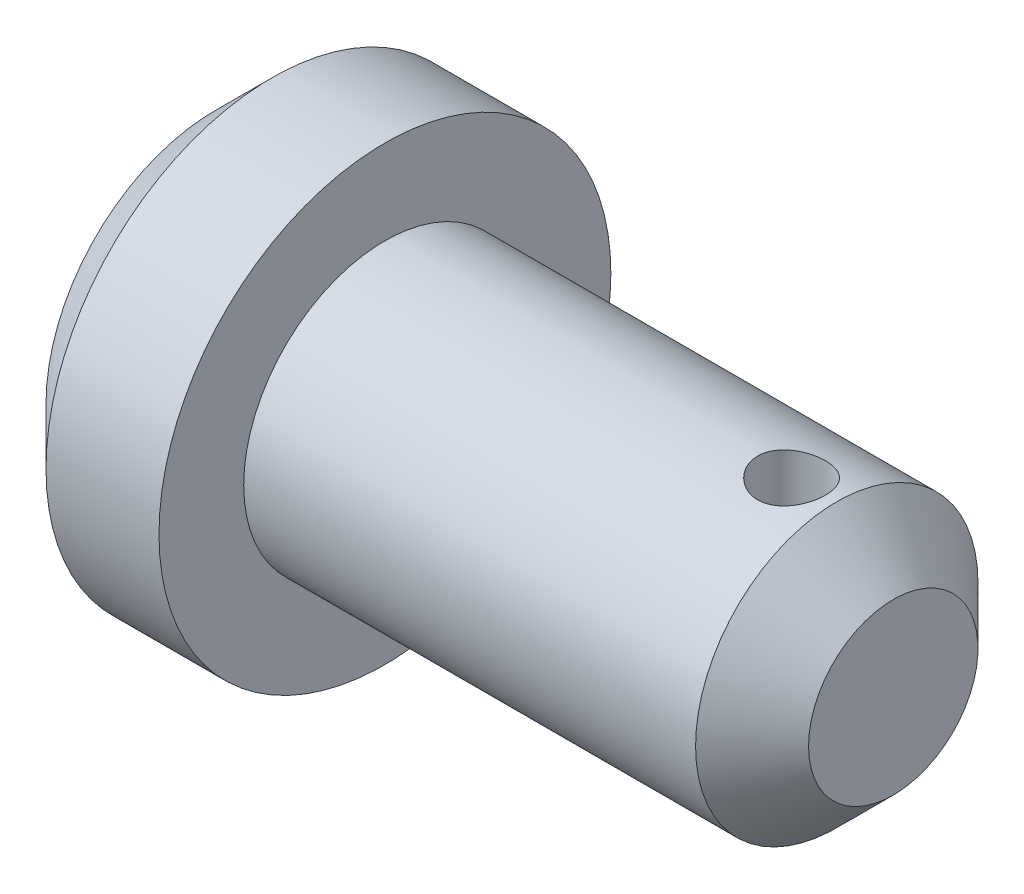
ISO-10303-21;
HEADER;
FILE_DESCRIPTION(('STEP AP214'),'2;1');
FILE_NAME('part.step','',(''),(''),'','','');
FILE_SCHEMA(('AUTOMOTIVE_DESIGN { 1 0 10303 214 1 1 1 1 }'));
ENDSEC;
DATA;
#1=APPLICATION_CONTEXT('core data for automotive mechanical design processes');
#2=APPLICATION_PROTOCOL_DEFINITION('international standard','automotive_design',2000,#1);
#3=PRODUCT_CONTEXT('',#1,'mechanical');
#4=PRODUCT('Part','Part','',(#3));
#5=PRODUCT_RELATED_PRODUCT_CATEGORY('part','',(#4));
#6=PRODUCT_DEFINITION_FORMATION('','',#4);
#7=PRODUCT_DEFINITION_CONTEXT('part definition',#1,'design');
#8=PRODUCT_DEFINITION('design','',#6,#7);
#9=PRODUCT_DEFINITION_SHAPE('','',#8);
#10=(LENGTH_UNIT() NAMED_UNIT(*) SI_UNIT(.MILLI.,.METRE.));
#11=(NAMED_UNIT(*) PLANE_ANGLE_UNIT() SI_UNIT($,.RADIAN.));
#12=(NAMED_UNIT(*) SI_UNIT($,.STERADIAN.) SOLID_ANGLE_UNIT());
#13=UNCERTAINTY_MEASURE_WITH_UNIT(LENGTH_MEASURE(1.E-05),#10,'distance_accuracy_value','');
#14=(GEOMETRIC_REPRESENTATION_CONTEXT(3) GLOBAL_UNCERTAINTY_ASSIGNED_CONTEXT((#13)) GLOBAL_UNIT_ASSIGNED_CONTEXT((#10,
#11,#12)) REPRESENTATION_CONTEXT('',''));
#15=CARTESIAN_POINT('',(0.,0.,0.));
#16=DIRECTION('',(0.,0.,1.));
#17=DIRECTION('',(1.,0.,0.));
#18=AXIS2_PLACEMENT_3D('',#15,#16,#17);
#19=CARTESIAN_POINT('',(0.,0.,0.));
#20=DIRECTION('',(-1.,0.,0.));
#21=DIRECTION('',(0.,0.,1.));
#22=AXIS2_PLACEMENT_3D('',#19,#20,#21);
#23=CYLINDRICAL_SURFACE('',#22,25.);
#24=CARTESIAN_POINT('',(102.,-24.2693221990232,-6.));
#25=CARTESIAN_POINT('',(101.834059732421,-24.2693192173439,-6.00000460058749));
#26=CARTESIAN_POINT('',(101.668170927862,-24.2710270328907,-5.99311472313627));
#27=CARTESIAN_POINT('',(101.337554797768,-24.2777997433195,-5.96562344868169));
#28=CARTESIAN_POINT('',(101.172827621959,-24.2828650632483,-5.94502031563237));
#29=CARTESIAN_POINT('',(100.845720994805,-24.2962060432289,-5.89025958920488));
#30=CARTESIAN_POINT('',(100.683342422632,-24.304482874777,-5.85609704951731));
#31=CARTESIAN_POINT('',(100.362077676706,-24.324002012079,-5.77448580831014));
#32=CARTESIAN_POINT('',(100.203192816905,-24.3352454135442,-5.72703219729494));
#33=CARTESIAN_POINT('',(99.8903344673029,-24.3603450339749,-5.61930954739399));
#34=CARTESIAN_POINT('',(99.7363534382128,-24.3741969907612,-5.55906139358703));
#35=CARTESIAN_POINT('',(99.4340110530831,-24.4041320001377,-5.42613868912028));
#36=CARTESIAN_POINT('',(99.2856517976633,-24.420215876438,-5.35345954837853));
#37=CARTESIAN_POINT('',(98.9956383615798,-24.4541500249133,-5.19624934621714));
#38=CARTESIAN_POINT('',(98.8539816961744,-24.471999634801,-5.11172272360157));
#39=CARTESIAN_POINT('',(98.5781694487184,-24.5089827826595,-4.93135257338601));
#40=CARTESIAN_POINT('',(98.4440167113146,-24.5281168015673,-4.83550479634857));
#41=CARTESIAN_POINT('',(98.1817872297769,-24.5674915774464,-4.63134479435269));
#42=CARTESIAN_POINT('',(98.0538624286457,-24.5877460219987,-4.52284000132129));
#43=CARTESIAN_POINT('',(97.8075154504067,-24.628482704143,-4.29548353417837));
#44=CARTESIAN_POINT('',(97.6890968171529,-24.6489650234755,-4.17662803548193));
#45=CARTESIAN_POINT('',(97.4626293146081,-24.6895792444555,-3.92942214664513));
#46=CARTESIAN_POINT('',(97.3545775870675,-24.7097112414296,-3.80107439098764));
#47=CARTESIAN_POINT('',(97.1495012350933,-24.749084932891,-3.53564701496837));
#48=CARTESIAN_POINT('',(97.0524806874831,-24.7683262966769,-3.39856419538247));
#49=CARTESIAN_POINT('',(96.86905555161,-24.805612728147,-3.11485061597086));
#50=CARTESIAN_POINT('',(96.7827982775735,-24.8236399057151,-2.96812218206264));
#51=CARTESIAN_POINT('',(96.6229465907055,-24.8577272433076,-2.66763492888514));
#52=CARTESIAN_POINT('',(96.5493569572847,-24.8737866602544,-2.51387348368351));
#53=CARTESIAN_POINT('',(96.4154867338232,-24.9034639147108,-2.20050084057474));
#54=CARTESIAN_POINT('',(96.3551998030764,-24.917082914856,-2.04089247207775));
#55=CARTESIAN_POINT('',(96.2483649391805,-24.9415044760467,-1.71693448898555));
#56=CARTESIAN_POINT('',(96.2018219511619,-24.9523060231976,-1.55258319115472));
#57=CARTESIAN_POINT('',(96.0849911599461,-24.9796180760798,-1.0604267514532));
#58=CARTESIAN_POINT('',(96.0348243465292,-24.9916494382249,-0.727223064781638));
#59=CARTESIAN_POINT('',(96.0018598223319,-24.9995546719704,-0.225051972672738));
#60=CARTESIAN_POINT('',(95.9979260461296,-25.0004978214515,-0.0572008556931647));
#61=CARTESIAN_POINT('',(96.0041100366233,-24.9990135577545,0.278247999700321));
#62=CARTESIAN_POINT('',(96.014227977215,-24.9965861028638,0.445845734952837));
#63=CARTESIAN_POINT('',(96.0649257254733,-24.9844710986104,0.939451198306504));
#64=CARTESIAN_POINT('',(96.1253937190891,-24.9700581884779,1.26352376365918));
#65=CARTESIAN_POINT('',(96.2981839251966,-24.9299774285752,1.89661000878181));
#66=CARTESIAN_POINT('',(96.4105087710679,-24.9043090072343,2.20562292291579));
#67=CARTESIAN_POINT('',(96.6847735436076,-24.8441871252282,2.80308340285013));
#68=CARTESIAN_POINT('',(96.8471264788453,-24.8096609520016,3.09133416391588));
#69=CARTESIAN_POINT('',(97.2165269000294,-24.7355808399422,3.63689114777195));
#70=CARTESIAN_POINT('',(97.423581610417,-24.6960260888452,3.89419235819688));
#71=CARTESIAN_POINT('',(97.8826307930772,-24.6150468786432,4.37733250714646));
#72=CARTESIAN_POINT('',(98.1356187298665,-24.5736003966327,4.60222487048295));
#73=CARTESIAN_POINT('',(98.6761512747884,-24.4944202534268,5.00659136952867));
#74=CARTESIAN_POINT('',(98.9636972486,-24.4566867390692,5.18606370943939));
#75=CARTESIAN_POINT('',(99.5669305117367,-24.3891322466935,5.4950396533725));
#76=CARTESIAN_POINT('',(99.8827301014658,-24.3593449045093,5.62433186444417));
#77=CARTESIAN_POINT('',(100.532466247427,-24.3114966451333,5.82770650444349));
#78=CARTESIAN_POINT('',(100.866399250898,-24.2934334398264,5.90179970658058));
#79=CARTESIAN_POINT('',(101.534186758633,-24.2715545321338,5.99113700492853));
#80=CARTESIAN_POINT('',(101.867844139552,-24.2674017566251,6.00777368474904));
#81=CARTESIAN_POINT('',(102.533166393619,-24.2728991225919,5.98552405004056));
#82=CARTESIAN_POINT('',(102.86483143198,-24.2825481032417,5.9466424049974));
#83=CARTESIAN_POINT('',(103.511691814451,-24.3142403018894,5.81567711192227));
#84=CARTESIAN_POINT('',(103.827058277452,-24.3360979424442,5.72438949541309));
#85=CARTESIAN_POINT('',(104.438015715724,-24.3895714349639,5.49207803402932));
#86=CARTESIAN_POINT('',(104.733604488375,-24.421188371618,5.35104866039818));
#87=CARTESIAN_POINT('',(105.302557221846,-24.491337816706,5.0202958832683));
#88=CARTESIAN_POINT('',(105.575417684589,-24.529985907154,4.82973151657672));
#89=CARTESIAN_POINT('',(106.085802531372,-24.609553113729,4.40637723136316));
#90=CARTESIAN_POINT('',(106.32332157398,-24.6504725718652,4.17358094176829));
#91=CARTESIAN_POINT('',(106.761825956424,-24.7311017019711,3.66607172916322));
#92=CARTESIAN_POINT('',(106.961852187838,-24.770762345906,3.3905223617437));
#93=CARTESIAN_POINT('',(107.312832249533,-24.8434406642277,2.80874047615626));
#94=CARTESIAN_POINT('',(107.4637885744,-24.8764586762761,2.50250951879602));
#95=CARTESIAN_POINT('',(107.649364452397,-24.9181020803638,2.02815096730082));
#96=CARTESIAN_POINT('',(107.704308244051,-24.9306431435962,1.86803584664664));
#97=CARTESIAN_POINT('',(107.800515366414,-24.9528307363167,1.54356696295539));
#98=CARTESIAN_POINT('',(107.841783825984,-24.9624783508485,1.3792148139756));
#99=CARTESIAN_POINT('',(107.910290311299,-24.9785993962541,1.04746058126015));
#100=CARTESIAN_POINT('',(107.937527628012,-24.9850726667188,0.88005834383764));
#101=CARTESIAN_POINT('',(107.977740185572,-24.994659296045,0.543455945222832));
#102=CARTESIAN_POINT('',(107.99071603876,-24.997772799164,0.374255861539254));
#103=CARTESIAN_POINT('',(108.002147010849,-25.0005148115007,0.039572166263602));
#104=CARTESIAN_POINT('',(108.000956570223,-25.0002283873103,-0.125898766906477));
#105=CARTESIAN_POINT('',(107.984919900709,-24.9963838456846,-0.456136647513656));
#106=CARTESIAN_POINT('',(107.970073968145,-24.9928257992435,-0.620903610148953));
#107=CARTESIAN_POINT('',(107.926847259929,-24.9825354772041,-0.948575696498029));
#108=CARTESIAN_POINT('',(107.898464447974,-24.9758027240481,-1.11148053632313));
#109=CARTESIAN_POINT('',(107.828408810135,-24.9593507893913,-1.434191004048));
#110=CARTESIAN_POINT('',(107.786740696019,-24.9496326667265,-1.59399770944887));
#111=CARTESIAN_POINT('',(107.690650753289,-24.9275215666658,-1.90878490028135));
#112=CARTESIAN_POINT('',(107.636284317004,-24.9151402247435,-2.06378312590839));
#113=CARTESIAN_POINT('',(107.515138852887,-24.8880146824749,-2.36857079597771));
#114=CARTESIAN_POINT('',(107.448364162904,-24.8732713081285,-2.51836203909183));
#115=CARTESIAN_POINT('',(107.302847567221,-24.841802398867,-2.81187682420641));
#116=CARTESIAN_POINT('',(107.224100462436,-24.8250760035128,-2.95559769529925));
#117=CARTESIAN_POINT('',(107.055243309792,-24.7900921246488,-3.23593617076045));
#118=CARTESIAN_POINT('',(106.965137043432,-24.7718351513474,-3.37255611776949));
#119=CARTESIAN_POINT('',(106.771977422558,-24.7338351675459,-3.64090348698623));
#120=CARTESIAN_POINT('',(106.668676486658,-24.7140678232284,-3.77244930795077));
#121=CARTESIAN_POINT('',(106.451544769352,-24.6739715765701,-4.02636882328124));
#122=CARTESIAN_POINT('',(106.337717606122,-24.6536428688592,-4.14874564331391));
#123=CARTESIAN_POINT('',(106.100184609401,-24.6129603609016,-4.38365180469934));
#124=CARTESIAN_POINT('',(105.976472868406,-24.5926065529162,-4.49617517167719));
#125=CARTESIAN_POINT('',(105.720085361673,-24.5524543239015,-4.71050671781096));
#126=CARTESIAN_POINT('',(105.587412870277,-24.532655703704,-4.81231877656934));
#127=CARTESIAN_POINT('',(105.311562626492,-24.4938254842292,-5.00624248933444));
#128=CARTESIAN_POINT('',(105.168243136498,-24.474813007441,-5.09815651544129));
#129=CARTESIAN_POINT('',(104.874205691691,-24.4384897622653,-5.26952462166943));
#130=CARTESIAN_POINT('',(104.723490485579,-24.4211783687267,-5.34898328559685));
#131=CARTESIAN_POINT('',(104.415717284004,-24.3887740639133,-5.49484184745972));
#132=CARTESIAN_POINT('',(104.258662364921,-24.3736800927344,-5.56124798952492));
#133=CARTESIAN_POINT('',(103.939315517869,-24.3461620490209,-5.6805037284954));
#134=CARTESIAN_POINT('',(103.77702444086,-24.3337375451432,-5.7333555158345));
#135=CARTESIAN_POINT('',(103.350944402755,-24.3054947105591,-5.85223691155717));
#136=CARTESIAN_POINT('',(103.083926407974,-24.2920191452792,-5.90755575023753));
#137=CARTESIAN_POINT('',(102.544559192327,-24.2739356520306,-5.98143220718613));
#138=CARTESIAN_POINT('',(102.272210353942,-24.2693270902047,-5.99999245314254));
#139=CARTESIAN_POINT('',(102.,-24.2693221990232,-6.));
#140=B_SPLINE_CURVE_WITH_KNOTS('',3,(#24,#25,#26,#27,#28,#29,#30,#31,#32,#33,#34,#35,#36,#37,
#38,#39,#40,#41,#42,#43,#44,#45,#46,#47,#48,#49,#50,#51,#52,#53,#54,#55,#56,#57,#58,#59,#60,#61,
#62,#63,#64,#65,#66,#67,#68,#69,#70,#71,#72,#73,#74,#75,#76,#77,#78,#79,#80,#81,#82,#83,#84,#85,
#86,#87,#88,#89,#90,#91,#92,#93,#94,#95,#96,#97,#98,#99,#100,#101,#102,#103,#104,#105,#106,#107,
#108,#109,#110,#111,#112,#113,#114,#115,#116,#117,#118,#119,#120,#121,#122,#123,#124,#125,#126,
#127,#128,#129,#130,#131,#132,#133,#134,#135,#136,#137,#138,#139),.UNSPECIFIED.,.T.,.F.,(4,2,2,
2,2,2,2,2,2,2,2,2,2,2,2,2,2,2,2,2,2,2,2,2,2,2,2,2,2,2,2,2,2,2,2,2,2,2,2,2,2,2,2,2,2,2,2,2,2,2,2,
2,2,2,2,2,2,4),(0.,0.49758059138039,0.995224186553656,1.4930494832496,1.99105891120689,
2.48826158123244,2.98564823885731,3.48284904015122,3.98023706425766,4.48653742340698,
4.99302566076187,5.4993738510141,6.00590856964271,6.51875380835026,7.03179211782624,
7.54458535785561,8.05756287894231,9.06317072582739,9.56637068685641,10.0695768752428,
11.0544731736286,12.0394194922331,13.0327253814724,14.0261919233719,15.0444773123883,
16.0628029556731,17.0853730875996,18.1077435918426,19.1051538629732,20.10248024975,
21.0850439079104,22.0677168116698,23.0683069952269,24.0690482527067,25.0926627677996,
26.1162252368616,26.624940138715,27.1334640332021,27.6420136222755,28.150541375013,
28.6463730888496,29.1421940434048,29.6380896060201,30.1338094895388,30.6274060608767,
31.1208303973834,31.6144696213306,32.1079449431356,32.6126284711583,33.1171391648262,
33.6219536669565,34.1265846927702,34.6399206216221,35.1530671874621,35.6659676710412,
36.1787852157025,36.9950805869967,37.8113176033061),.UNSPECIFIED.);
#141=CARTESIAN_POINT('',(102.,-24.2693221990232,-6.));
#142=VERTEX_POINT('',#141);
#143=EDGE_CURVE('E53',#142,#142,#140,.T.);
#144=ORIENTED_EDGE('',*,*,#143,.T.);
#145=EDGE_LOOP('',(#144));
#146=FACE_BOUND('',#145,.T.);
#147=CARTESIAN_POINT('',(110.,0.,0.));
#148=DIRECTION('',(-1.,0.,0.));
#149=DIRECTION('',(0.,0.,1.));
#150=AXIS2_PLACEMENT_3D('',#147,#148,#149);
#151=CIRCLE('',#150,25.);
#152=CARTESIAN_POINT('',(110.,0.,25.));
#153=VERTEX_POINT('',#152);
#154=EDGE_CURVE('E45',#153,#153,#151,.T.);
#155=ORIENTED_EDGE('',*,*,#154,.T.);
#156=EDGE_LOOP('',(#155));
#157=FACE_BOUND('',#156,.T.);
#158=CARTESIAN_POINT('',(30.,0.,0.));
#159=DIRECTION('',(-1.,0.,0.));
#160=DIRECTION('',(0.,0.,1.));
#161=AXIS2_PLACEMENT_3D('',#158,#159,#160);
#162=CIRCLE('',#161,25.);
#163=CARTESIAN_POINT('',(30.,0.,25.));
#164=VERTEX_POINT('',#163);
#165=EDGE_CURVE('E94',#164,#164,#162,.T.);
#166=ORIENTED_EDGE('',*,*,#165,.F.);
#167=EDGE_LOOP('',(#166));
#168=FACE_BOUND('',#167,.T.);
#169=CARTESIAN_POINT('',(102.,24.2693221990232,-6.));
#170=CARTESIAN_POINT('',(102.165940267579,24.2693192173439,-6.00000460058749));
#171=CARTESIAN_POINT('',(102.331829072138,24.2710270328907,-5.99311472313627));
#172=CARTESIAN_POINT('',(102.662445202232,24.2777997433195,-5.96562344868169));
#173=CARTESIAN_POINT('',(102.827172378041,24.2828650632483,-5.94502031563237));
#174=CARTESIAN_POINT('',(103.154279005195,24.2962060432289,-5.89025958920488));
#175=CARTESIAN_POINT('',(103.316657577368,24.304482874777,-5.85609704951731));
#176=CARTESIAN_POINT('',(103.637922323294,24.324002012079,-5.77448580831014));
#177=CARTESIAN_POINT('',(103.796807183095,24.3352454135442,-5.72703219729494));
#178=CARTESIAN_POINT('',(104.109665532697,24.3603450339749,-5.61930954739399));
#179=CARTESIAN_POINT('',(104.263646561787,24.3741969907612,-5.55906139358703));
#180=CARTESIAN_POINT('',(104.565988946917,24.4041320001377,-5.42613868912028));
#181=CARTESIAN_POINT('',(104.714348202337,24.420215876438,-5.35345954837853));
#182=CARTESIAN_POINT('',(105.00436163842,24.4541500249133,-5.19624934621714));
#183=CARTESIAN_POINT('',(105.146018303826,24.471999634801,-5.11172272360157));
#184=CARTESIAN_POINT('',(105.421830551282,24.5089827826595,-4.93135257338601));
#185=CARTESIAN_POINT('',(105.555983288685,24.5281168015673,-4.83550479634857));
#186=CARTESIAN_POINT('',(105.818212770223,24.5674915774464,-4.63134479435269));
#187=CARTESIAN_POINT('',(105.946137571354,24.5877460219987,-4.52284000132129));
#188=CARTESIAN_POINT('',(106.192484549593,24.628482704143,-4.29548353417837));
#189=CARTESIAN_POINT('',(106.310903182847,24.6489650234755,-4.17662803548193));
#190=CARTESIAN_POINT('',(106.537370685392,24.6895792444555,-3.92942214664513));
#191=CARTESIAN_POINT('',(106.645422412932,24.7097112414296,-3.80107439098764));
#192=CARTESIAN_POINT('',(106.850498764907,24.749084932891,-3.53564701496837));
#193=CARTESIAN_POINT('',(106.947519312517,24.7683262966769,-3.39856419538247));
#194=CARTESIAN_POINT('',(107.13094444839,24.805612728147,-3.11485061597086));
#195=CARTESIAN_POINT('',(107.217201722426,24.8236399057151,-2.96812218206264));
#196=CARTESIAN_POINT('',(107.377053409294,24.8577272433076,-2.66763492888514));
#197=CARTESIAN_POINT('',(107.450643042715,24.8737866602544,-2.51387348368351));
#198=CARTESIAN_POINT('',(107.584513266177,24.9034639147108,-2.20050084057474));
#199=CARTESIAN_POINT('',(107.644800196924,24.917082914856,-2.04089247207775));
#200=CARTESIAN_POINT('',(107.751635060819,24.9415044760467,-1.71693448898555));
#201=CARTESIAN_POINT('',(107.798178048838,24.9523060231976,-1.55258319115472));
#202=CARTESIAN_POINT('',(107.915008840054,24.9796180760798,-1.0604267514532));
#203=CARTESIAN_POINT('',(107.965175653471,24.9916494382249,-0.727223064781637));
#204=CARTESIAN_POINT('',(107.998140177668,24.9995546719704,-0.225051972672737));
#205=CARTESIAN_POINT('',(108.00207395387,25.0004978214515,-0.0572008556931635));
#206=CARTESIAN_POINT('',(107.995889963377,24.9990135577545,0.278247999700322));
#207=CARTESIAN_POINT('',(107.985772022785,24.9965861028638,0.445845734952837));
#208=CARTESIAN_POINT('',(107.935074274527,24.9844710986104,0.939451198306504));
#209=CARTESIAN_POINT('',(107.874606280911,24.9700581884779,1.26352376365918));
#210=CARTESIAN_POINT('',(107.701816074803,24.9299774285752,1.89661000878181));
#211=CARTESIAN_POINT('',(107.589491228932,24.9043090072343,2.20562292291579));
#212=CARTESIAN_POINT('',(107.315226456392,24.8441871252282,2.80308340285013));
#213=CARTESIAN_POINT('',(107.152873521155,24.8096609520016,3.09133416391588));
#214=CARTESIAN_POINT('',(106.783473099971,24.7355808399422,3.63689114777195));
#215=CARTESIAN_POINT('',(106.576418389583,24.6960260888452,3.89419235819688));
#216=CARTESIAN_POINT('',(106.117369206923,24.6150468786432,4.37733250714646));
#217=CARTESIAN_POINT('',(105.864381270134,24.5736003966327,4.60222487048295));
#218=CARTESIAN_POINT('',(105.323848725212,24.4944202534268,5.00659136952867));
#219=CARTESIAN_POINT('',(105.0363027514,24.4566867390692,5.18606370943939));
#220=CARTESIAN_POINT('',(104.433069488263,24.3891322466935,5.4950396533725));
#221=CARTESIAN_POINT('',(104.117269898534,24.3593449045093,5.62433186444417));
#222=CARTESIAN_POINT('',(103.467533752573,24.3114966451333,5.82770650444349));
#223=CARTESIAN_POINT('',(103.133600749102,24.2934334398264,5.90179970658058));
#224=CARTESIAN_POINT('',(102.465813241367,24.2715545321338,5.99113700492853));
#225=CARTESIAN_POINT('',(102.132155860448,24.2674017566251,6.00777368474904));
#226=CARTESIAN_POINT('',(101.466833606381,24.2728991225919,5.98552405004056));
#227=CARTESIAN_POINT('',(101.13516856802,24.2825481032417,5.9466424049974));
#228=CARTESIAN_POINT('',(100.488308185549,24.3142403018894,5.81567711192227));
#229=CARTESIAN_POINT('',(100.172941722548,24.3360979424442,5.72438949541309));
#230=CARTESIAN_POINT('',(99.5619842842756,24.3895714349639,5.49207803402932));
#231=CARTESIAN_POINT('',(99.2663955116254,24.421188371618,5.35104866039818));
#232=CARTESIAN_POINT('',(98.6974427781538,24.491337816706,5.0202958832683));
#233=CARTESIAN_POINT('',(98.4245823154112,24.529985907154,4.82973151657672));
#234=CARTESIAN_POINT('',(97.9141974686284,24.609553113729,4.40637723136316));
#235=CARTESIAN_POINT('',(97.6766784260197,24.6504725718652,4.17358094176829));
#236=CARTESIAN_POINT('',(97.2381740435764,24.7311017019711,3.66607172916322));
#237=CARTESIAN_POINT('',(97.0381478121625,24.770762345906,3.3905223617437));
#238=CARTESIAN_POINT('',(96.6871677504673,24.8434406642277,2.80874047615626));
#239=CARTESIAN_POINT('',(96.5362114256,24.8764586762761,2.50250951879602));
#240=CARTESIAN_POINT('',(96.3506355476032,24.9181020803638,2.02815096730082));
#241=CARTESIAN_POINT('',(96.2956917559489,24.9306431435962,1.86803584664665));
#242=CARTESIAN_POINT('',(96.1994846335862,24.9528307363167,1.5435669629554));
#243=CARTESIAN_POINT('',(96.1582161740161,24.9624783508485,1.37921481397561));
#244=CARTESIAN_POINT('',(96.0897096887009,24.9785993962541,1.04746058126016));
#245=CARTESIAN_POINT('',(96.0624723719879,24.9850726667188,0.880058343837644));
#246=CARTESIAN_POINT('',(96.0222598144282,24.994659296045,0.543455945222834));
#247=CARTESIAN_POINT('',(96.0092839612402,24.997772799164,0.374255861539255));
#248=CARTESIAN_POINT('',(95.9978529891506,25.0005148115007,0.039572166263602));
#249=CARTESIAN_POINT('',(95.9990434297774,25.0002283873103,-0.125898766906477));
#250=CARTESIAN_POINT('',(96.0150800992914,24.9963838456846,-0.456136647513656));
#251=CARTESIAN_POINT('',(96.0299260318547,24.9928257992435,-0.620903610148953));
#252=CARTESIAN_POINT('',(96.0731527400705,24.9825354772041,-0.948575696498028));
#253=CARTESIAN_POINT('',(96.1015355520261,24.9758027240481,-1.11148053632312));
#254=CARTESIAN_POINT('',(96.1715911898645,24.9593507893913,-1.434191004048));
#255=CARTESIAN_POINT('',(96.2132593039809,24.9496326667265,-1.59399770944887));
#256=CARTESIAN_POINT('',(96.309349246711,24.9275215666658,-1.90878490028135));
#257=CARTESIAN_POINT('',(96.3637156829956,24.9151402247435,-2.06378312590839));
#258=CARTESIAN_POINT('',(96.4848611471134,24.8880146824749,-2.36857079597771));
#259=CARTESIAN_POINT('',(96.5516358370964,24.8732713081285,-2.51836203909183));
#260=CARTESIAN_POINT('',(96.6971524327788,24.841802398867,-2.81187682420642));
#261=CARTESIAN_POINT('',(96.7758995375637,24.8250760035128,-2.95559769529926));
#262=CARTESIAN_POINT('',(96.9447566902079,24.7900921246488,-3.23593617076046));
#263=CARTESIAN_POINT('',(97.0348629565684,24.7718351513474,-3.37255611776949));
#264=CARTESIAN_POINT('',(97.228022577442,24.7338351675459,-3.64090348698623));
#265=CARTESIAN_POINT('',(97.3313235133422,24.7140678232284,-3.77244930795077));
#266=CARTESIAN_POINT('',(97.5484552306476,24.6739715765701,-4.02636882328124));
#267=CARTESIAN_POINT('',(97.6622823938778,24.6536428688592,-4.14874564331391));
#268=CARTESIAN_POINT('',(97.8998153905987,24.6129603609016,-4.38365180469934));
#269=CARTESIAN_POINT('',(98.0235271315938,24.5926065529162,-4.49617517167719));
#270=CARTESIAN_POINT('',(98.2799146383274,24.5524543239015,-4.71050671781096));
#271=CARTESIAN_POINT('',(98.4125871297228,24.532655703704,-4.81231877656934));
#272=CARTESIAN_POINT('',(98.6884373735082,24.4938254842292,-5.00624248933444));
#273=CARTESIAN_POINT('',(98.8317568635018,24.474813007441,-5.09815651544129));
#274=CARTESIAN_POINT('',(99.1257943083088,24.4384897622653,-5.26952462166943));
#275=CARTESIAN_POINT('',(99.2765095144213,24.4211783687267,-5.34898328559685));
#276=CARTESIAN_POINT('',(99.5842827159965,24.3887740639133,-5.49484184745972));
#277=CARTESIAN_POINT('',(99.7413376350791,24.3736800927344,-5.56124798952492));
#278=CARTESIAN_POINT('',(100.060684482131,24.3461620490209,-5.6805037284954));
#279=CARTESIAN_POINT('',(100.22297555914,24.3337375451432,-5.7333555158345));
#280=CARTESIAN_POINT('',(100.649055597245,24.3054947105591,-5.85223691155717));
#281=CARTESIAN_POINT('',(100.916073592026,24.2920191452793,-5.90755575023753));
#282=CARTESIAN_POINT('',(101.455440807673,24.2739356520306,-5.98143220718613));
#283=CARTESIAN_POINT('',(101.727789646057,24.2693270902047,-5.99999245314254));
#284=CARTESIAN_POINT('',(102.,24.2693221990232,-6.));
#285=B_SPLINE_CURVE_WITH_KNOTS('',3,(#169,#170,#171,#172,#173,#174,#175,#176,#177,#178,#179,
#180,#181,#182,#183,#184,#185,#186,#187,#188,#189,#190,#191,#192,#193,#194,#195,#196,#197,#198,
#199,#200,#201,#202,#203,#204,#205,#206,#207,#208,#209,#210,#211,#212,#213,#214,#215,#216,#217,
#218,#219,#220,#221,#222,#223,#224,#225,#226,#227,#228,#229,#230,#231,#232,#233,#234,#235,#236,
#237,#238,#239,#240,#241,#242,#243,#244,#245,#246,#247,#248,#249,#250,#251,#252,#253,#254,#255,
#256,#257,#258,#259,#260,#261,#262,#263,#264,#265,#266,#267,#268,#269,#270,#271,#272,#273,#274,
#275,#276,#277,#278,#279,#280,#281,#282,#283,#284),.UNSPECIFIED.,.T.,.F.,(4,2,2,2,2,2,2,2,2,2,2,
2,2,2,2,2,2,2,2,2,2,2,2,2,2,2,2,2,2,2,2,2,2,2,2,2,2,2,2,2,2,2,2,2,2,2,2,2,2,2,2,2,2,2,2,2,2,4),
(0.,0.49758059138039,0.995224186553656,1.4930494832496,1.99105891120689,2.48826158123244,
2.98564823885731,3.48284904015122,3.98023706425766,4.48653742340698,4.99302566076187,
5.4993738510141,6.00590856964271,6.51875380835026,7.03179211782624,7.54458535785561,
8.05756287894231,9.06317072582739,9.56637068685642,10.0695768752428,11.0544731736286,
12.0394194922331,13.0327253814724,14.0261919233719,15.0444773123883,16.0628029556732,
17.0853730875996,18.1077435918426,19.1051538629732,20.10248024975,21.0850439079104,
22.0677168116698,23.0683069952269,24.0690482527067,25.0926627677996,26.1162252368616,
26.624940138715,27.1334640332021,27.6420136222755,28.1505413750131,28.6463730888496,
29.1421940434048,29.6380896060201,30.1338094895389,30.6274060608767,31.1208303973834,
31.6144696213306,32.1079449431356,32.6126284711584,33.1171391648262,33.6219536669565,
34.1265846927703,34.6399206216221,35.1530671874622,35.6659676710412,36.1787852157025,
36.9950805869967,37.8113176033061),.UNSPECIFIED.);
#286=CARTESIAN_POINT('',(102.,24.2693221990232,-6.));
#287=VERTEX_POINT('',#286);
#288=EDGE_CURVE('E37',#287,#287,#285,.T.);
#289=ORIENTED_EDGE('',*,*,#288,.T.);
#290=EDGE_LOOP('',(#289));
#291=FACE_BOUND('',#290,.T.);
#292=ADVANCED_FACE('F33',(#146,#157,#168,#291),#23,.T.);
#293=CARTESIAN_POINT('',(120.,0.,0.));
#294=DIRECTION('',(-1.,0.,0.));
#295=DIRECTION('',(0.,0.,1.));
#296=AXIS2_PLACEMENT_3D('',#293,#294,#295);
#297=PLANE('',#296);
#298=CARTESIAN_POINT('',(120.,0.,0.));
#299=DIRECTION('',(-1.,0.,0.));
#300=DIRECTION('',(0.,0.,1.));
#301=AXIS2_PLACEMENT_3D('',#298,#299,#300);
#302=CIRCLE('',#301,15.);
#303=CARTESIAN_POINT('',(120.,0.,15.));
#304=VERTEX_POINT('',#303);
#305=EDGE_CURVE('E10',#304,#304,#302,.F.);
#306=ORIENTED_EDGE('',*,*,#305,.T.);
#307=EDGE_LOOP('',(#306));
#308=FACE_BOUND('',#307,.T.);
#309=ADVANCED_FACE('F76',(#308),#297,.F.);
#310=CARTESIAN_POINT('',(30.,0.,0.));
#311=DIRECTION('',(-1.,0.,0.));
#312=DIRECTION('',(0.,0.,1.));
#313=AXIS2_PLACEMENT_3D('',#310,#311,#312);
#314=PLANE('',#313);
#315=CARTESIAN_POINT('',(30.,0.,0.));
#316=DIRECTION('',(-1.,0.,0.));
#317=DIRECTION('',(0.,0.,1.));
#318=AXIS2_PLACEMENT_3D('',#315,#316,#317);
#319=CIRCLE('',#318,40.);
#320=CARTESIAN_POINT('',(30.,0.,40.));
#321=VERTEX_POINT('',#320);
#322=EDGE_CURVE('E97',#321,#321,#319,.T.);
#323=ORIENTED_EDGE('',*,*,#322,.F.);
#324=EDGE_LOOP('',(#323));
#325=FACE_BOUND('',#324,.T.);
#326=ORIENTED_EDGE('',*,*,#165,.T.);
#327=EDGE_LOOP('',(#326));
#328=FACE_BOUND('',#327,.T.);
#329=ADVANCED_FACE('F73',(#325,#328),#314,.F.);
#330=CARTESIAN_POINT('',(0.,0.,0.));
#331=DIRECTION('',(-1.,0.,0.));
#332=DIRECTION('',(0.,0.,1.));
#333=AXIS2_PLACEMENT_3D('',#330,#331,#332);
#334=CYLINDRICAL_SURFACE('',#333,40.);
#335=CARTESIAN_POINT('',(10.,0.,0.));
#336=DIRECTION('',(-1.,0.,0.));
#337=DIRECTION('',(0.,0.,1.));
#338=AXIS2_PLACEMENT_3D('',#335,#336,#337);
#339=CIRCLE('',#338,40.);
#340=CARTESIAN_POINT('',(10.,0.,40.));
#341=VERTEX_POINT('',#340);
#342=EDGE_CURVE('E50',#341,#341,#339,.F.);
#343=ORIENTED_EDGE('',*,*,#342,.T.);
#344=EDGE_LOOP('',(#343));
#345=FACE_BOUND('',#344,.T.);
#346=ORIENTED_EDGE('',*,*,#322,.T.);
#347=EDGE_LOOP('',(#346));
#348=FACE_BOUND('',#347,.T.);
#349=ADVANCED_FACE('F70',(#345,#348),#334,.T.);
#350=CARTESIAN_POINT('',(0.,0.,0.));
#351=DIRECTION('',(-1.,0.,0.));
#352=DIRECTION('',(0.,0.,1.));
#353=AXIS2_PLACEMENT_3D('',#350,#351,#352);
#354=PLANE('',#353);
#355=CARTESIAN_POINT('',(0.,0.,0.));
#356=DIRECTION('',(-1.,0.,0.));
#357=DIRECTION('',(0.,0.,1.));
#358=AXIS2_PLACEMENT_3D('',#355,#356,#357);
#359=CIRCLE('',#358,30.);
#360=CARTESIAN_POINT('',(0.,0.,30.));
#361=VERTEX_POINT('',#360);
#362=EDGE_CURVE('E101',#361,#361,#359,.T.);
#363=ORIENTED_EDGE('',*,*,#362,.T.);
#364=EDGE_LOOP('',(#363));
#365=FACE_BOUND('',#364,.T.);
#366=ADVANCED_FACE('F65',(#365),#354,.T.);
#367=CARTESIAN_POINT('',(0.,0.,0.));
#368=DIRECTION('',(1.,0.,0.));
#369=DIRECTION('',(0.,0.,-1.));
#370=AXIS2_PLACEMENT_3D('',#367,#368,#369);
#371=CONICAL_SURFACE('',#370,30.,0.785398163397447);
#372=ORIENTED_EDGE('',*,*,#342,.F.);
#373=EDGE_LOOP('',(#372));
#374=FACE_BOUND('',#373,.T.);
#375=ORIENTED_EDGE('',*,*,#362,.F.);
#376=EDGE_LOOP('',(#375));
#377=FACE_BOUND('',#376,.T.);
#378=ADVANCED_FACE('F69',(#374,#377),#371,.T.);
#379=CARTESIAN_POINT('',(110.,0.,0.));
#380=DIRECTION('',(-1.,0.,0.));
#381=DIRECTION('',(0.,0.,1.));
#382=AXIS2_PLACEMENT_3D('',#379,#380,#381);
#383=CONICAL_SURFACE('',#382,25.,0.785398163397451);
#384=ORIENTED_EDGE('',*,*,#305,.F.);
#385=EDGE_LOOP('',(#384));
#386=FACE_BOUND('',#385,.T.);
#387=ORIENTED_EDGE('',*,*,#154,.F.);
#388=EDGE_LOOP('',(#387));
#389=FACE_BOUND('',#388,.T.);
#390=ADVANCED_FACE('F35',(#386,#389),#383,.T.);
#391=CARTESIAN_POINT('',(102.,250.,0.));
#392=DIRECTION('',(0.,-1.,0.));
#393=DIRECTION('',(0.,0.,-1.));
#394=AXIS2_PLACEMENT_3D('',#391,#392,#393);
#395=CYLINDRICAL_SURFACE('',#394,6.);
#396=ORIENTED_EDGE('',*,*,#288,.F.);
#397=EDGE_LOOP('',(#396));
#398=FACE_BOUND('',#397,.T.);
#399=ORIENTED_EDGE('',*,*,#143,.F.);
#400=EDGE_LOOP('',(#399));
#401=FACE_BOUND('',#400,.T.);
#402=ADVANCED_FACE('F60',(#398,#401),#395,.F.);
#403=CLOSED_SHELL('',(#292,#309,#329,#349,#366,#378,#390,#402));
#404=MANIFOLD_SOLID_BREP('B2',#403);
#405=ADVANCED_BREP_SHAPE_REPRESENTATION('',(#18,#404),#14);
#406=SHAPE_DEFINITION_REPRESENTATION(#9,#405);
ENDSEC;
END-ISO-10303-21;
